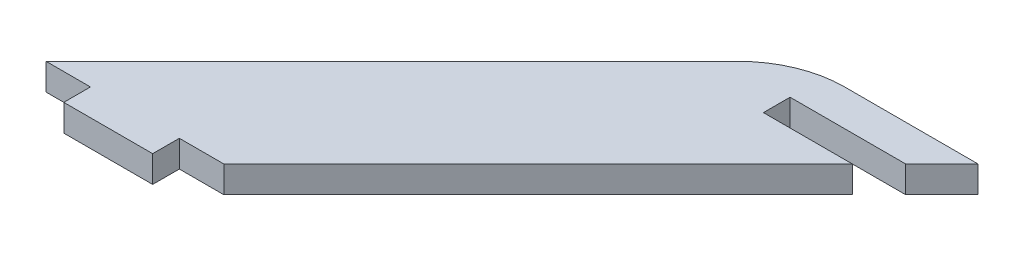
ISO-10303-21;
HEADER;
FILE_DESCRIPTION(('STEP AP214'),'2;1');
FILE_NAME('part.step','',(''),(''),'','','');
FILE_SCHEMA(('AUTOMOTIVE_DESIGN { 1 0 10303 214 1 1 1 1 }'));
ENDSEC;
DATA;
#1=APPLICATION_CONTEXT('core data for automotive mechanical design processes');
#2=APPLICATION_PROTOCOL_DEFINITION('international standard','automotive_design',2000,#1);
#3=PRODUCT_CONTEXT('',#1,'mechanical');
#4=PRODUCT('Part','Part','',(#3));
#5=PRODUCT_RELATED_PRODUCT_CATEGORY('part','',(#4));
#6=PRODUCT_DEFINITION_FORMATION('','',#4);
#7=PRODUCT_DEFINITION_CONTEXT('part definition',#1,'design');
#8=PRODUCT_DEFINITION('design','',#6,#7);
#9=PRODUCT_DEFINITION_SHAPE('','',#8);
#10=(LENGTH_UNIT() NAMED_UNIT(*) SI_UNIT(.MILLI.,.METRE.));
#11=(NAMED_UNIT(*) PLANE_ANGLE_UNIT() SI_UNIT($,.RADIAN.));
#12=(NAMED_UNIT(*) SI_UNIT($,.STERADIAN.) SOLID_ANGLE_UNIT());
#13=UNCERTAINTY_MEASURE_WITH_UNIT(LENGTH_MEASURE(1.E-05),#10,'distance_accuracy_value','');
#14=(GEOMETRIC_REPRESENTATION_CONTEXT(3) GLOBAL_UNCERTAINTY_ASSIGNED_CONTEXT((#13)) GLOBAL_UNIT_ASSIGNED_CONTEXT((#10,
#11,#12)) REPRESENTATION_CONTEXT('',''));
#15=CARTESIAN_POINT('',(0.,0.,0.));
#16=DIRECTION('',(0.,0.,1.));
#17=DIRECTION('',(1.,0.,0.));
#18=AXIS2_PLACEMENT_3D('',#15,#16,#17);
#19=CARTESIAN_POINT('',(-12.9892530320117,3.,17.5403194893765));
#20=DIRECTION('',(1.,0.,0.));
#21=DIRECTION('',(0.,0.,-1.));
#22=AXIS2_PLACEMENT_3D('',#19,#20,#21);
#23=PLANE('',#22);
#24=DIRECTION('',(0.,0.,1.));
#25=VECTOR('',#24,1.);
#26=CARTESIAN_POINT('',(-12.9892530320117,0.,17.5403194893765));
#27=LINE('',#26,#25);
#28=CARTESIAN_POINT('',(-12.9892530320117,0.,14.5403194893765));
#29=VERTEX_POINT('',#28);
#30=CARTESIAN_POINT('',(-12.9892530320117,0.,17.5403194893765));
#31=VERTEX_POINT('',#30);
#32=EDGE_CURVE('E176',#29,#31,#27,.T.);
#33=ORIENTED_EDGE('',*,*,#32,.T.);
#34=DIRECTION('',(0.,-1.,0.));
#35=VECTOR('',#34,1.);
#36=CARTESIAN_POINT('',(-12.9892530320117,3.,17.5403194893765));
#37=LINE('',#36,#35);
#38=CARTESIAN_POINT('',(-12.9892530320117,3.,17.5403194893765));
#39=VERTEX_POINT('',#38);
#40=EDGE_CURVE('E11',#39,#31,#37,.T.);
#41=ORIENTED_EDGE('',*,*,#40,.F.);
#42=DIRECTION('',(0.,0.,1.));
#43=VECTOR('',#42,1.);
#44=CARTESIAN_POINT('',(-12.9892530320117,3.,17.5403194893765));
#45=LINE('',#44,#43);
#46=CARTESIAN_POINT('',(-12.9892530320117,3.,14.5403194893765));
#47=VERTEX_POINT('',#46);
#48=EDGE_CURVE('E213',#47,#39,#45,.T.);
#49=ORIENTED_EDGE('',*,*,#48,.F.);
#50=DIRECTION('',(0.,-1.,0.));
#51=VECTOR('',#50,1.);
#52=CARTESIAN_POINT('',(-12.9892530320117,3.,14.5403194893765));
#53=LINE('',#52,#51);
#54=EDGE_CURVE('E172',#47,#29,#53,.T.);
#55=ORIENTED_EDGE('',*,*,#54,.T.);
#56=EDGE_LOOP('',(#33,#41,#49,#55));
#57=FACE_BOUND('',#56,.T.);
#58=ADVANCED_FACE('F45',(#57),#23,.F.);
#59=CARTESIAN_POINT('',(-12.9892530320117,3.,17.5403194893765));
#60=DIRECTION('',(0.,0.,-1.));
#61=DIRECTION('',(-1.,0.,0.));
#62=AXIS2_PLACEMENT_3D('',#59,#60,#61);
#63=PLANE('',#62);
#64=DIRECTION('',(1.,0.,0.));
#65=VECTOR('',#64,1.);
#66=CARTESIAN_POINT('',(-12.9892530320117,0.,17.5403194893765));
#67=LINE('',#66,#65);
#68=CARTESIAN_POINT('',(-2.98925303201166,0.,17.5403194893765));
#69=VERTEX_POINT('',#68);
#70=EDGE_CURVE('E180',#31,#69,#67,.T.);
#71=ORIENTED_EDGE('',*,*,#70,.T.);
#72=DIRECTION('',(0.,-1.,0.));
#73=VECTOR('',#72,1.);
#74=CARTESIAN_POINT('',(-2.98925303201166,3.,17.5403194893765));
#75=LINE('',#74,#73);
#76=CARTESIAN_POINT('',(-2.98925303201166,3.,17.5403194893765));
#77=VERTEX_POINT('',#76);
#78=EDGE_CURVE('E54',#77,#69,#75,.T.);
#79=ORIENTED_EDGE('',*,*,#78,.F.);
#80=DIRECTION('',(1.,0.,0.));
#81=VECTOR('',#80,1.);
#82=CARTESIAN_POINT('',(-12.9892530320117,3.,17.5403194893765));
#83=LINE('',#82,#81);
#84=EDGE_CURVE('E120',#39,#77,#83,.T.);
#85=ORIENTED_EDGE('',*,*,#84,.F.);
#86=ORIENTED_EDGE('',*,*,#40,.T.);
#87=EDGE_LOOP('',(#71,#79,#85,#86));
#88=FACE_BOUND('',#87,.T.);
#89=ADVANCED_FACE('F314',(#88),#63,.F.);
#90=CARTESIAN_POINT('',(-2.98925303201166,3.,17.5403194893765));
#91=DIRECTION('',(-1.,0.,0.));
#92=DIRECTION('',(0.,0.,1.));
#93=AXIS2_PLACEMENT_3D('',#90,#91,#92);
#94=PLANE('',#93);
#95=DIRECTION('',(0.,0.,-1.));
#96=VECTOR('',#95,1.);
#97=CARTESIAN_POINT('',(-2.98925303201166,0.,17.5403194893765));
#98=LINE('',#97,#96);
#99=CARTESIAN_POINT('',(-2.98925303201166,0.,14.5403194893765));
#100=VERTEX_POINT('',#99);
#101=EDGE_CURVE('E183',#69,#100,#98,.T.);
#102=ORIENTED_EDGE('',*,*,#101,.T.);
#103=DIRECTION('',(0.,-1.,0.));
#104=VECTOR('',#103,1.);
#105=CARTESIAN_POINT('',(-2.98925303201166,3.,14.5403194893765));
#106=LINE('',#105,#104);
#107=CARTESIAN_POINT('',(-2.98925303201166,3.,14.5403194893765));
#108=VERTEX_POINT('',#107);
#109=EDGE_CURVE('E244',#108,#100,#106,.T.);
#110=ORIENTED_EDGE('',*,*,#109,.F.);
#111=DIRECTION('',(0.,0.,-1.));
#112=VECTOR('',#111,1.);
#113=CARTESIAN_POINT('',(-2.98925303201166,3.,17.5403194893765));
#114=LINE('',#113,#112);
#115=EDGE_CURVE('E254',#77,#108,#114,.T.);
#116=ORIENTED_EDGE('',*,*,#115,.F.);
#117=ORIENTED_EDGE('',*,*,#78,.T.);
#118=EDGE_LOOP('',(#102,#110,#116,#117));
#119=FACE_BOUND('',#118,.T.);
#120=ADVANCED_FACE('F252',(#119),#94,.F.);
#121=CARTESIAN_POINT('',(-2.98925303201166,3.,14.5403194893765));
#122=DIRECTION('',(0.,0.,-1.));
#123=DIRECTION('',(-1.,0.,0.));
#124=AXIS2_PLACEMENT_3D('',#121,#122,#123);
#125=PLANE('',#124);
#126=DIRECTION('',(1.,0.,0.));
#127=VECTOR('',#126,1.);
#128=CARTESIAN_POINT('',(-2.98925303201166,0.,14.5403194893765));
#129=LINE('',#128,#127);
#130=CARTESIAN_POINT('',(2.01074696798834,0.,14.5403194893765));
#131=VERTEX_POINT('',#130);
#132=EDGE_CURVE('E186',#100,#131,#129,.T.);
#133=ORIENTED_EDGE('',*,*,#132,.T.);
#134=DIRECTION('',(0.,-1.,0.));
#135=VECTOR('',#134,1.);
#136=CARTESIAN_POINT('',(2.01074696798834,3.,14.5403194893765));
#137=LINE('',#136,#135);
#138=CARTESIAN_POINT('',(2.01074696798834,3.,14.5403194893765));
#139=VERTEX_POINT('',#138);
#140=EDGE_CURVE('E240',#139,#131,#137,.T.);
#141=ORIENTED_EDGE('',*,*,#140,.F.);
#142=DIRECTION('',(1.,0.,0.));
#143=VECTOR('',#142,1.);
#144=CARTESIAN_POINT('',(-2.98925303201166,3.,14.5403194893765));
#145=LINE('',#144,#143);
#146=EDGE_CURVE('E273',#108,#139,#145,.T.);
#147=ORIENTED_EDGE('',*,*,#146,.F.);
#148=ORIENTED_EDGE('',*,*,#109,.T.);
#149=EDGE_LOOP('',(#133,#141,#147,#148));
#150=FACE_BOUND('',#149,.T.);
#151=ADVANCED_FACE('F263',(#150),#125,.F.);
#152=CARTESIAN_POINT('',(2.01074696798834,3.,14.5403194893765));
#153=DIRECTION('',(-0.707106781186548,0.,-0.707106781186548));
#154=DIRECTION('',(-0.707106781186548,0.,0.707106781186548));
#155=AXIS2_PLACEMENT_3D('',#152,#153,#154);
#156=PLANE('',#155);
#157=DIRECTION('',(0.707106781186547,0.,-0.707106781186547));
#158=VECTOR('',#157,1.);
#159=CARTESIAN_POINT('',(2.01074696798834,0.,14.5403194893765));
#160=LINE('',#159,#158);
#161=CARTESIAN_POINT('',(37.3660860273157,0.,-20.8150195699509));
#162=VERTEX_POINT('',#161);
#163=EDGE_CURVE('E189',#131,#162,#160,.T.);
#164=ORIENTED_EDGE('',*,*,#163,.T.);
#165=DIRECTION('',(0.,-1.,0.));
#166=VECTOR('',#165,1.);
#167=CARTESIAN_POINT('',(37.3660860273157,3.,-20.8150195699509));
#168=LINE('',#167,#166);
#169=CARTESIAN_POINT('',(37.3660860273157,3.,-20.8150195699509));
#170=VERTEX_POINT('',#169);
#171=EDGE_CURVE('E236',#170,#162,#168,.T.);
#172=ORIENTED_EDGE('',*,*,#171,.F.);
#173=DIRECTION('',(0.707106781186547,0.,-0.707106781186547));
#174=VECTOR('',#173,1.);
#175=CARTESIAN_POINT('',(2.01074696798834,3.,14.5403194893765));
#176=LINE('',#175,#174);
#177=EDGE_CURVE('E269',#139,#170,#176,.T.);
#178=ORIENTED_EDGE('',*,*,#177,.F.);
#179=ORIENTED_EDGE('',*,*,#140,.T.);
#180=EDGE_LOOP('',(#164,#172,#178,#179));
#181=FACE_BOUND('',#180,.T.);
#182=ADVANCED_FACE('F267',(#181),#156,.F.);
#183=CARTESIAN_POINT('',(37.3660860273157,3.,-20.8150195699509));
#184=DIRECTION('',(0.,0.,1.));
#185=DIRECTION('',(1.,0.,0.));
#186=AXIS2_PLACEMENT_3D('',#183,#184,#185);
#187=PLANE('',#186);
#188=DIRECTION('',(-1.,0.,0.));
#189=VECTOR('',#188,1.);
#190=CARTESIAN_POINT('',(37.3660860273157,0.,-20.8150195699509));
#191=LINE('',#190,#189);
#192=CARTESIAN_POINT('',(27.3660860273157,0.,-20.8150195699509));
#193=VERTEX_POINT('',#192);
#194=EDGE_CURVE('E192',#162,#193,#191,.T.);
#195=ORIENTED_EDGE('',*,*,#194,.T.);
#196=DIRECTION('',(0.,-1.,0.));
#197=VECTOR('',#196,1.);
#198=CARTESIAN_POINT('',(27.3660860273157,3.,-20.8150195699509));
#199=LINE('',#198,#197);
#200=CARTESIAN_POINT('',(27.3660860273157,3.,-20.8150195699509));
#201=VERTEX_POINT('',#200);
#202=EDGE_CURVE('E232',#201,#193,#199,.T.);
#203=ORIENTED_EDGE('',*,*,#202,.F.);
#204=DIRECTION('',(-1.,0.,0.));
#205=VECTOR('',#204,1.);
#206=CARTESIAN_POINT('',(37.3660860273157,3.,-20.8150195699509));
#207=LINE('',#206,#205);
#208=EDGE_CURVE('E272',#170,#201,#207,.T.);
#209=ORIENTED_EDGE('',*,*,#208,.F.);
#210=ORIENTED_EDGE('',*,*,#171,.T.);
#211=EDGE_LOOP('',(#195,#203,#209,#210));
#212=FACE_BOUND('',#211,.T.);
#213=ADVANCED_FACE('F327',(#212),#187,.F.);
#214=CARTESIAN_POINT('',(27.3660860273157,3.,-20.8150195699509));
#215=DIRECTION('',(-1.,0.,0.));
#216=DIRECTION('',(0.,0.,1.));
#217=AXIS2_PLACEMENT_3D('',#214,#215,#216);
#218=PLANE('',#217);
#219=DIRECTION('',(0.,0.,-1.));
#220=VECTOR('',#219,1.);
#221=CARTESIAN_POINT('',(27.3660860273157,0.,-20.8150195699509));
#222=LINE('',#221,#220);
#223=CARTESIAN_POINT('',(27.3660860273157,0.,-23.8150195699509));
#224=VERTEX_POINT('',#223);
#225=EDGE_CURVE('E195',#193,#224,#222,.T.);
#226=ORIENTED_EDGE('',*,*,#225,.T.);
#227=DIRECTION('',(0.,-1.,0.));
#228=VECTOR('',#227,1.);
#229=CARTESIAN_POINT('',(27.3660860273157,3.,-23.8150195699509));
#230=LINE('',#229,#228);
#231=CARTESIAN_POINT('',(27.3660860273157,3.,-23.8150195699509));
#232=VERTEX_POINT('',#231);
#233=EDGE_CURVE('E228',#232,#224,#230,.T.);
#234=ORIENTED_EDGE('',*,*,#233,.F.);
#235=DIRECTION('',(0.,0.,-1.));
#236=VECTOR('',#235,1.);
#237=CARTESIAN_POINT('',(27.3660860273157,3.,-20.8150195699509));
#238=LINE('',#237,#236);
#239=EDGE_CURVE('E277',#201,#232,#238,.T.);
#240=ORIENTED_EDGE('',*,*,#239,.F.);
#241=ORIENTED_EDGE('',*,*,#202,.T.);
#242=EDGE_LOOP('',(#226,#234,#240,#241));
#243=FACE_BOUND('',#242,.T.);
#244=ADVANCED_FACE('F330',(#243),#218,.F.);
#245=CARTESIAN_POINT('',(40.3660860273157,3.,-23.8150195699509));
#246=DIRECTION('',(0.,0.,-1.));
#247=DIRECTION('',(-1.,0.,0.));
#248=AXIS2_PLACEMENT_3D('',#245,#246,#247);
#249=PLANE('',#248);
#250=DIRECTION('',(1.,0.,0.));
#251=VECTOR('',#250,1.);
#252=CARTESIAN_POINT('',(40.3660860273157,0.,-23.8150195699509));
#253=LINE('',#252,#251);
#254=CARTESIAN_POINT('',(40.3660860273157,0.,-23.8150195699509));
#255=VERTEX_POINT('',#254);
#256=EDGE_CURVE('E198',#224,#255,#253,.T.);
#257=ORIENTED_EDGE('',*,*,#256,.T.);
#258=DIRECTION('',(0.,-1.,0.));
#259=VECTOR('',#258,1.);
#260=CARTESIAN_POINT('',(40.3660860273157,3.,-23.8150195699509));
#261=LINE('',#260,#259);
#262=CARTESIAN_POINT('',(40.3660860273157,3.,-23.8150195699509));
#263=VERTEX_POINT('',#262);
#264=EDGE_CURVE('E224',#263,#255,#261,.T.);
#265=ORIENTED_EDGE('',*,*,#264,.F.);
#266=DIRECTION('',(1.,0.,0.));
#267=VECTOR('',#266,1.);
#268=CARTESIAN_POINT('',(40.3660860273157,3.,-23.8150195699509));
#269=LINE('',#268,#267);
#270=EDGE_CURVE('E284',#232,#263,#269,.T.);
#271=ORIENTED_EDGE('',*,*,#270,.F.);
#272=ORIENTED_EDGE('',*,*,#233,.T.);
#273=EDGE_LOOP('',(#257,#265,#271,#272));
#274=FACE_BOUND('',#273,.T.);
#275=ADVANCED_FACE('F334',(#274),#249,.F.);
#276=CARTESIAN_POINT('',(44.4371538391812,3.,-27.8860873818163));
#277=DIRECTION('',(-0.707106781186548,0.,-0.707106781186547));
#278=DIRECTION('',(-0.707106781186547,0.,0.707106781186548));
#279=AXIS2_PLACEMENT_3D('',#276,#277,#278);
#280=PLANE('',#279);
#281=DIRECTION('',(0.707106781186547,0.,-0.707106781186548));
#282=VECTOR('',#281,1.);
#283=CARTESIAN_POINT('',(44.4371538391812,0.,-27.8860873818163));
#284=LINE('',#283,#282);
#285=CARTESIAN_POINT('',(44.4371538391812,0.,-27.8860873818163));
#286=VERTEX_POINT('',#285);
#287=EDGE_CURVE('E201',#255,#286,#284,.T.);
#288=ORIENTED_EDGE('',*,*,#287,.T.);
#289=DIRECTION('',(0.,-1.,0.));
#290=VECTOR('',#289,1.);
#291=CARTESIAN_POINT('',(44.4371538391812,3.,-27.8860873818163));
#292=LINE('',#291,#290);
#293=CARTESIAN_POINT('',(44.4371538391812,3.,-27.8860873818163));
#294=VERTEX_POINT('',#293);
#295=EDGE_CURVE('E220',#294,#286,#292,.T.);
#296=ORIENTED_EDGE('',*,*,#295,.F.);
#297=DIRECTION('',(0.707106781186547,0.,-0.707106781186548));
#298=VECTOR('',#297,1.);
#299=CARTESIAN_POINT('',(44.4371538391812,3.,-27.8860873818163));
#300=LINE('',#299,#298);
#301=EDGE_CURVE('E287',#263,#294,#300,.T.);
#302=ORIENTED_EDGE('',*,*,#301,.F.);
#303=ORIENTED_EDGE('',*,*,#264,.T.);
#304=EDGE_LOOP('',(#288,#296,#302,#303));
#305=FACE_BOUND('',#304,.T.);
#306=ADVANCED_FACE('F295',(#305),#280,.F.);
#307=CARTESIAN_POINT('',(29.4371538391812,3.,-27.8860873818163));
#308=DIRECTION('',(0.,0.,1.));
#309=DIRECTION('',(1.,0.,0.));
#310=AXIS2_PLACEMENT_3D('',#307,#308,#309);
#311=PLANE('',#310);
#312=DIRECTION('',(-1.,0.,0.));
#313=VECTOR('',#312,1.);
#314=CARTESIAN_POINT('',(29.4371538391812,0.,-27.8860873818163));
#315=LINE('',#314,#313);
#316=CARTESIAN_POINT('',(29.4371538391812,0.,-27.8860873818163));
#317=VERTEX_POINT('',#316);
#318=EDGE_CURVE('E204',#286,#317,#315,.T.);
#319=ORIENTED_EDGE('',*,*,#318,.T.);
#320=DIRECTION('',(0.,-1.,0.));
#321=VECTOR('',#320,1.);
#322=CARTESIAN_POINT('',(29.4371538391812,3.,-27.8860873818163));
#323=LINE('',#322,#321);
#324=CARTESIAN_POINT('',(29.4371538391812,3.,-27.8860873818163));
#325=VERTEX_POINT('',#324);
#326=EDGE_CURVE('E165',#325,#317,#323,.T.);
#327=ORIENTED_EDGE('',*,*,#326,.F.);
#328=DIRECTION('',(-1.,0.,0.));
#329=VECTOR('',#328,1.);
#330=CARTESIAN_POINT('',(29.4371538391812,3.,-27.8860873818163));
#331=LINE('',#330,#329);
#332=EDGE_CURVE('E154',#294,#325,#331,.T.);
#333=ORIENTED_EDGE('',*,*,#332,.F.);
#334=ORIENTED_EDGE('',*,*,#295,.T.);
#335=EDGE_LOOP('',(#319,#327,#333,#334));
#336=FACE_BOUND('',#335,.T.);
#337=ADVANCED_FACE('F299',(#336),#311,.F.);
#338=CARTESIAN_POINT('',(29.4371538391812,3.,-15.8150195699509));
#339=DIRECTION('',(0.,-1.,0.));
#340=DIRECTION('',(0.,0.,-1.));
#341=AXIS2_PLACEMENT_3D('',#338,#339,#340);
#342=CYLINDRICAL_SURFACE('',#341,12.0710678118655);
#343=CARTESIAN_POINT('',(29.4371538391812,0.,-15.8150195699509));
#344=DIRECTION('',(0.,1.,0.));
#345=DIRECTION('',(0.,0.,-1.));
#346=AXIS2_PLACEMENT_3D('',#343,#344,#345);
#347=CIRCLE('',#346,12.0710678118655);
#348=CARTESIAN_POINT('',(20.9016199332484,0.,-24.3505534758836));
#349=VERTEX_POINT('',#348);
#350=EDGE_CURVE('E163',#317,#349,#347,.T.);
#351=ORIENTED_EDGE('',*,*,#350,.T.);
#352=DIRECTION('',(0.,-1.,0.));
#353=VECTOR('',#352,1.);
#354=CARTESIAN_POINT('',(20.9016199332484,3.,-24.3505534758836));
#355=LINE('',#354,#353);
#356=CARTESIAN_POINT('',(20.9016199332484,3.,-24.3505534758836));
#357=VERTEX_POINT('',#356);
#358=EDGE_CURVE('E160',#357,#349,#355,.T.);
#359=ORIENTED_EDGE('',*,*,#358,.F.);
#360=CARTESIAN_POINT('',(29.4371538391812,3.,-15.8150195699509));
#361=DIRECTION('',(0.,1.,0.));
#362=DIRECTION('',(0.,0.,-1.));
#363=AXIS2_PLACEMENT_3D('',#360,#361,#362);
#364=CIRCLE('',#363,12.0710678118655);
#365=EDGE_CURVE('E148',#325,#357,#364,.T.);
#366=ORIENTED_EDGE('',*,*,#365,.F.);
#367=ORIENTED_EDGE('',*,*,#326,.T.);
#368=EDGE_LOOP('',(#351,#359,#366,#367));
#369=FACE_BOUND('',#368,.T.);
#370=ADVANCED_FACE('F161',(#369),#342,.T.);
#371=CARTESIAN_POINT('',(-17.9892530320117,3.,14.5403194893765));
#372=DIRECTION('',(0.707106781186548,0.,0.707106781186548));
#373=DIRECTION('',(0.707106781186548,0.,-0.707106781186548));
#374=AXIS2_PLACEMENT_3D('',#371,#372,#373);
#375=PLANE('',#374);
#376=DIRECTION('',(-0.707106781186547,0.,0.707106781186547));
#377=VECTOR('',#376,1.);
#378=CARTESIAN_POINT('',(-17.9892530320117,0.,14.5403194893765));
#379=LINE('',#378,#377);
#380=CARTESIAN_POINT('',(-17.9892530320117,0.,14.5403194893765));
#381=VERTEX_POINT('',#380);
#382=EDGE_CURVE('E106',#349,#381,#379,.T.);
#383=ORIENTED_EDGE('',*,*,#382,.T.);
#384=DIRECTION('',(0.,-1.,0.));
#385=VECTOR('',#384,1.);
#386=CARTESIAN_POINT('',(-17.9892530320117,3.,14.5403194893765));
#387=LINE('',#386,#385);
#388=CARTESIAN_POINT('',(-17.9892530320117,3.,14.5403194893765));
#389=VERTEX_POINT('',#388);
#390=EDGE_CURVE('E166',#389,#381,#387,.T.);
#391=ORIENTED_EDGE('',*,*,#390,.F.);
#392=DIRECTION('',(-0.707106781186547,0.,0.707106781186547));
#393=VECTOR('',#392,1.);
#394=CARTESIAN_POINT('',(-17.9892530320117,3.,14.5403194893765));
#395=LINE('',#394,#393);
#396=EDGE_CURVE('E152',#357,#389,#395,.T.);
#397=ORIENTED_EDGE('',*,*,#396,.F.);
#398=ORIENTED_EDGE('',*,*,#358,.T.);
#399=EDGE_LOOP('',(#383,#391,#397,#398));
#400=FACE_BOUND('',#399,.T.);
#401=ADVANCED_FACE('F168',(#400),#375,.F.);
#402=CARTESIAN_POINT('',(-12.9892530320117,3.,14.5403194893765));
#403=DIRECTION('',(0.,0.,-1.));
#404=DIRECTION('',(-1.,0.,0.));
#405=AXIS2_PLACEMENT_3D('',#402,#403,#404);
#406=PLANE('',#405);
#407=DIRECTION('',(1.,0.,0.));
#408=VECTOR('',#407,1.);
#409=CARTESIAN_POINT('',(-12.9892530320117,0.,14.5403194893765));
#410=LINE('',#409,#408);
#411=EDGE_CURVE('E112',#381,#29,#410,.T.);
#412=ORIENTED_EDGE('',*,*,#411,.T.);
#413=ORIENTED_EDGE('',*,*,#54,.F.);
#414=DIRECTION('',(1.,0.,0.));
#415=VECTOR('',#414,1.);
#416=CARTESIAN_POINT('',(-12.9892530320117,3.,14.5403194893765));
#417=LINE('',#416,#415);
#418=EDGE_CURVE('E62',#389,#47,#417,.T.);
#419=ORIENTED_EDGE('',*,*,#418,.F.);
#420=ORIENTED_EDGE('',*,*,#390,.T.);
#421=EDGE_LOOP('',(#412,#413,#419,#420));
#422=FACE_BOUND('',#421,.T.);
#423=ADVANCED_FACE('F303',(#422),#406,.F.);
#424=CARTESIAN_POINT('',(29.4371538391812,3.,-15.8150195699509));
#425=DIRECTION('',(0.,-1.,0.));
#426=DIRECTION('',(0.,0.,-1.));
#427=AXIS2_PLACEMENT_3D('',#424,#425,#426);
#428=PLANE('',#427);
#429=ORIENTED_EDGE('',*,*,#48,.T.);
#430=ORIENTED_EDGE('',*,*,#84,.T.);
#431=ORIENTED_EDGE('',*,*,#115,.T.);
#432=ORIENTED_EDGE('',*,*,#146,.T.);
#433=ORIENTED_EDGE('',*,*,#177,.T.);
#434=ORIENTED_EDGE('',*,*,#208,.T.);
#435=ORIENTED_EDGE('',*,*,#239,.T.);
#436=ORIENTED_EDGE('',*,*,#270,.T.);
#437=ORIENTED_EDGE('',*,*,#301,.T.);
#438=ORIENTED_EDGE('',*,*,#332,.T.);
#439=ORIENTED_EDGE('',*,*,#365,.T.);
#440=ORIENTED_EDGE('',*,*,#396,.T.);
#441=ORIENTED_EDGE('',*,*,#418,.T.);
#442=EDGE_LOOP('',(#429,#430,#431,#432,#433,#434,#435,#436,#437,#438,#439,#440,#441));
#443=FACE_BOUND('',#442,.T.);
#444=ADVANCED_FACE('F150',(#443),#428,.F.);
#445=CARTESIAN_POINT('',(29.4371538391812,0.,-15.8150195699509));
#446=DIRECTION('',(0.,-1.,0.));
#447=DIRECTION('',(0.,0.,-1.));
#448=AXIS2_PLACEMENT_3D('',#445,#446,#447);
#449=PLANE('',#448);
#450=ORIENTED_EDGE('',*,*,#32,.F.);
#451=ORIENTED_EDGE('',*,*,#411,.F.);
#452=ORIENTED_EDGE('',*,*,#382,.F.);
#453=ORIENTED_EDGE('',*,*,#350,.F.);
#454=ORIENTED_EDGE('',*,*,#318,.F.);
#455=ORIENTED_EDGE('',*,*,#287,.F.);
#456=ORIENTED_EDGE('',*,*,#256,.F.);
#457=ORIENTED_EDGE('',*,*,#225,.F.);
#458=ORIENTED_EDGE('',*,*,#194,.F.);
#459=ORIENTED_EDGE('',*,*,#163,.F.);
#460=ORIENTED_EDGE('',*,*,#132,.F.);
#461=ORIENTED_EDGE('',*,*,#101,.F.);
#462=ORIENTED_EDGE('',*,*,#70,.F.);
#463=EDGE_LOOP('',(#450,#451,#452,#453,#454,#455,#456,#457,#458,#459,#460,#461,#462));
#464=FACE_BOUND('',#463,.T.);
#465=ADVANCED_FACE('F258',(#464),#449,.T.);
#466=CLOSED_SHELL('',(#58,#89,#120,#151,#182,#213,#244,#275,#306,#337,#370,#401,#423,#444,#465));
#467=MANIFOLD_SOLID_BREP('B2',#466);
#468=ADVANCED_BREP_SHAPE_REPRESENTATION('',(#18,#467),#14);
#469=SHAPE_DEFINITION_REPRESENTATION(#9,#468);
ENDSEC;
END-ISO-10303-21;
